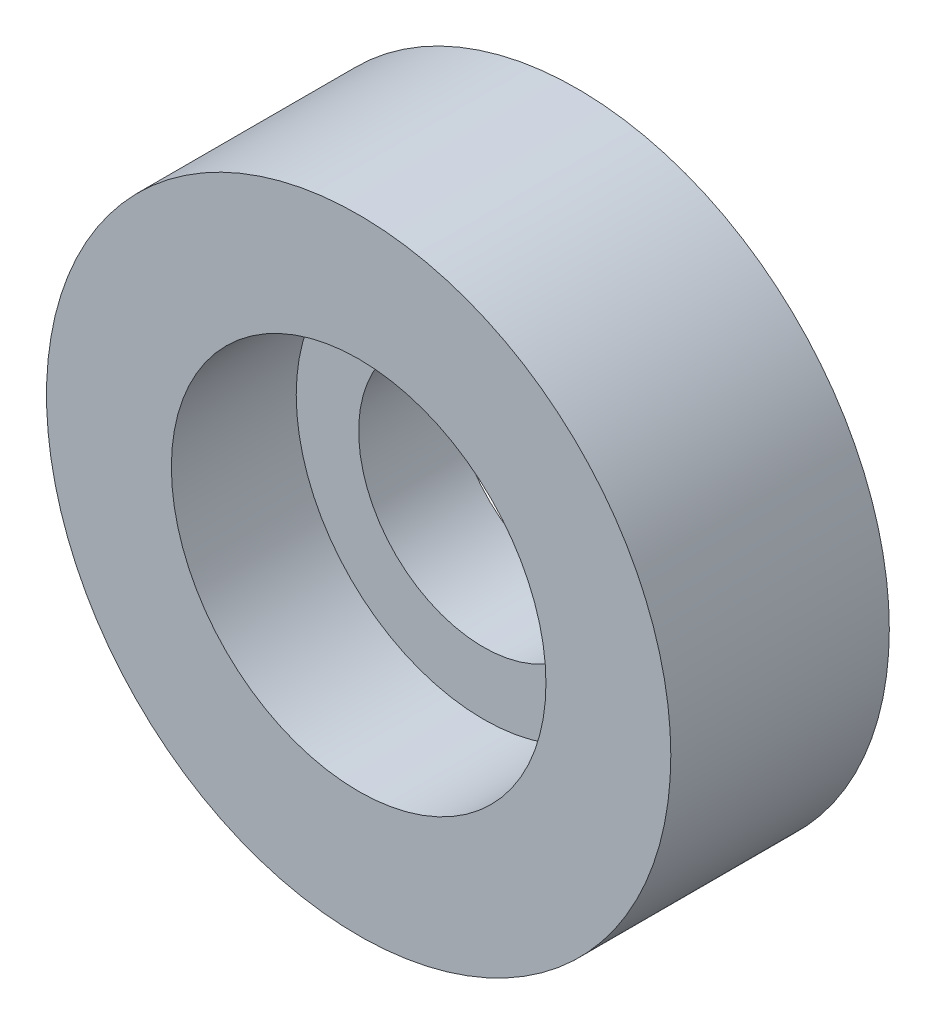
ISO-10303-21;
HEADER;
FILE_DESCRIPTION(('STEP AP214'),'2;1');
FILE_NAME('part.step','',(''),(''),'','','');
FILE_SCHEMA(('AUTOMOTIVE_DESIGN { 1 0 10303 214 1 1 1 1 }'));
ENDSEC;
DATA;
#1=APPLICATION_CONTEXT('core data for automotive mechanical design processes');
#2=APPLICATION_PROTOCOL_DEFINITION('international standard','automotive_design',2000,#1);
#3=PRODUCT_CONTEXT('',#1,'mechanical');
#4=PRODUCT('Part','Part','',(#3));
#5=PRODUCT_RELATED_PRODUCT_CATEGORY('part','',(#4));
#6=PRODUCT_DEFINITION_FORMATION('','',#4);
#7=PRODUCT_DEFINITION_CONTEXT('part definition',#1,'design');
#8=PRODUCT_DEFINITION('design','',#6,#7);
#9=PRODUCT_DEFINITION_SHAPE('','',#8);
#10=(LENGTH_UNIT() NAMED_UNIT(*) SI_UNIT(.MILLI.,.METRE.));
#11=(NAMED_UNIT(*) PLANE_ANGLE_UNIT() SI_UNIT($,.RADIAN.));
#12=(NAMED_UNIT(*) SI_UNIT($,.STERADIAN.) SOLID_ANGLE_UNIT());
#13=UNCERTAINTY_MEASURE_WITH_UNIT(LENGTH_MEASURE(1.E-05),#10,'distance_accuracy_value','');
#14=(GEOMETRIC_REPRESENTATION_CONTEXT(3) GLOBAL_UNCERTAINTY_ASSIGNED_CONTEXT((#13)) GLOBAL_UNIT_ASSIGNED_CONTEXT((#10,
#11,#12)) REPRESENTATION_CONTEXT('',''));
#15=CARTESIAN_POINT('',(0.,0.,0.));
#16=DIRECTION('',(0.,0.,1.));
#17=DIRECTION('',(1.,0.,0.));
#18=AXIS2_PLACEMENT_3D('',#15,#16,#17);
#19=CARTESIAN_POINT('',(0.,0.,1.5));
#20=DIRECTION('',(0.,0.,1.));
#21=DIRECTION('',(1.,0.,0.));
#22=AXIS2_PLACEMENT_3D('',#19,#20,#21);
#23=PLANE('',#22);
#24=CARTESIAN_POINT('',(0.,0.,1.5));
#25=DIRECTION('',(0.,0.,1.));
#26=DIRECTION('',(1.,0.,0.));
#27=AXIS2_PLACEMENT_3D('',#24,#25,#26);
#28=CIRCLE('',#27,2.);
#29=CARTESIAN_POINT('',(2.,0.,1.5));
#30=VERTEX_POINT('',#29);
#31=EDGE_CURVE('E42',#30,#30,#28,.T.);
#32=ORIENTED_EDGE('',*,*,#31,.F.);
#33=EDGE_LOOP('',(#32));
#34=FACE_BOUND('',#33,.T.);
#35=CARTESIAN_POINT('',(0.,0.,1.5));
#36=DIRECTION('',(0.,0.,1.));
#37=DIRECTION('',(1.,0.,0.));
#38=AXIS2_PLACEMENT_3D('',#35,#36,#37);
#39=CIRCLE('',#38,3.);
#40=CARTESIAN_POINT('',(3.,0.,1.5));
#41=VERTEX_POINT('',#40);
#42=EDGE_CURVE('E10',#41,#41,#39,.F.);
#43=ORIENTED_EDGE('',*,*,#42,.F.);
#44=EDGE_LOOP('',(#43));
#45=FACE_BOUND('',#44,.T.);
#46=ADVANCED_FACE('F31',(#34,#45),#23,.T.);
#47=CARTESIAN_POINT('',(0.,0.,0.));
#48=DIRECTION('',(0.,0.,1.));
#49=DIRECTION('',(1.,0.,0.));
#50=AXIS2_PLACEMENT_3D('',#47,#48,#49);
#51=PLANE('',#50);
#52=CARTESIAN_POINT('',(0.,0.,0.));
#53=DIRECTION('',(0.,0.,1.));
#54=DIRECTION('',(1.,0.,0.));
#55=AXIS2_PLACEMENT_3D('',#52,#53,#54);
#56=CIRCLE('',#55,5.);
#57=CARTESIAN_POINT('',(5.,0.,0.));
#58=VERTEX_POINT('',#57);
#59=EDGE_CURVE('E38',#58,#58,#56,.T.);
#60=ORIENTED_EDGE('',*,*,#59,.F.);
#61=EDGE_LOOP('',(#60));
#62=FACE_BOUND('',#61,.T.);
#63=CARTESIAN_POINT('',(0.,0.,0.));
#64=DIRECTION('',(0.,0.,1.));
#65=DIRECTION('',(1.,0.,0.));
#66=AXIS2_PLACEMENT_3D('',#63,#64,#65);
#67=CIRCLE('',#66,2.);
#68=CARTESIAN_POINT('',(2.,0.,0.));
#69=VERTEX_POINT('',#68);
#70=EDGE_CURVE('E46',#69,#69,#67,.T.);
#71=ORIENTED_EDGE('',*,*,#70,.T.);
#72=EDGE_LOOP('',(#71));
#73=FACE_BOUND('',#72,.T.);
#74=ADVANCED_FACE('F73',(#62,#73),#51,.F.);
#75=CARTESIAN_POINT('',(0.,0.,1.5));
#76=DIRECTION('',(0.,0.,-1.));
#77=DIRECTION('',(-1.,0.,0.));
#78=AXIS2_PLACEMENT_3D('',#75,#76,#77);
#79=CYLINDRICAL_SURFACE('',#78,5.);
#80=ORIENTED_EDGE('',*,*,#59,.T.);
#81=EDGE_LOOP('',(#80));
#82=FACE_BOUND('',#81,.T.);
#83=CARTESIAN_POINT('',(0.,0.,3.5));
#84=DIRECTION('',(0.,0.,1.));
#85=DIRECTION('',(1.,0.,0.));
#86=AXIS2_PLACEMENT_3D('',#83,#84,#85);
#87=CIRCLE('',#86,5.);
#88=CARTESIAN_POINT('',(5.,0.,3.5));
#89=VERTEX_POINT('',#88);
#90=EDGE_CURVE('E50',#89,#89,#87,.T.);
#91=ORIENTED_EDGE('',*,*,#90,.F.);
#92=EDGE_LOOP('',(#91));
#93=FACE_BOUND('',#92,.T.);
#94=ADVANCED_FACE('F33',(#82,#93),#79,.T.);
#95=CARTESIAN_POINT('',(0.,0.,1.5));
#96=DIRECTION('',(0.,0.,-1.));
#97=DIRECTION('',(-1.,0.,0.));
#98=AXIS2_PLACEMENT_3D('',#95,#96,#97);
#99=CYLINDRICAL_SURFACE('',#98,2.);
#100=ORIENTED_EDGE('',*,*,#31,.T.);
#101=EDGE_LOOP('',(#100));
#102=FACE_BOUND('',#101,.T.);
#103=ORIENTED_EDGE('',*,*,#70,.F.);
#104=EDGE_LOOP('',(#103));
#105=FACE_BOUND('',#104,.T.);
#106=ADVANCED_FACE('F62',(#102,#105),#99,.F.);
#107=CARTESIAN_POINT('',(0.,0.,3.5));
#108=DIRECTION('',(0.,0.,1.));
#109=DIRECTION('',(1.,0.,0.));
#110=AXIS2_PLACEMENT_3D('',#107,#108,#109);
#111=PLANE('',#110);
#112=ORIENTED_EDGE('',*,*,#90,.T.);
#113=EDGE_LOOP('',(#112));
#114=FACE_BOUND('',#113,.T.);
#115=CARTESIAN_POINT('',(0.,0.,3.5));
#116=DIRECTION('',(0.,0.,1.));
#117=DIRECTION('',(1.,0.,0.));
#118=AXIS2_PLACEMENT_3D('',#115,#116,#117);
#119=CIRCLE('',#118,3.);
#120=CARTESIAN_POINT('',(3.,0.,3.5));
#121=VERTEX_POINT('',#120);
#122=EDGE_CURVE('E54',#121,#121,#119,.T.);
#123=ORIENTED_EDGE('',*,*,#122,.F.);
#124=EDGE_LOOP('',(#123));
#125=FACE_BOUND('',#124,.T.);
#126=ADVANCED_FACE('F60',(#114,#125),#111,.T.);
#127=CARTESIAN_POINT('',(0.,0.,3.5));
#128=DIRECTION('',(0.,0.,-1.));
#129=DIRECTION('',(-1.,0.,0.));
#130=AXIS2_PLACEMENT_3D('',#127,#128,#129);
#131=CYLINDRICAL_SURFACE('',#130,3.);
#132=ORIENTED_EDGE('',*,*,#122,.T.);
#133=EDGE_LOOP('',(#132));
#134=FACE_BOUND('',#133,.T.);
#135=ORIENTED_EDGE('',*,*,#42,.T.);
#136=EDGE_LOOP('',(#135));
#137=FACE_BOUND('',#136,.T.);
#138=ADVANCED_FACE('F58',(#134,#137),#131,.F.);
#139=CLOSED_SHELL('',(#46,#74,#94,#106,#126,#138));
#140=MANIFOLD_SOLID_BREP('B2',#139);
#141=ADVANCED_BREP_SHAPE_REPRESENTATION('',(#18,#140),#14);
#142=SHAPE_DEFINITION_REPRESENTATION(#9,#141);
ENDSEC;
END-ISO-10303-21;
